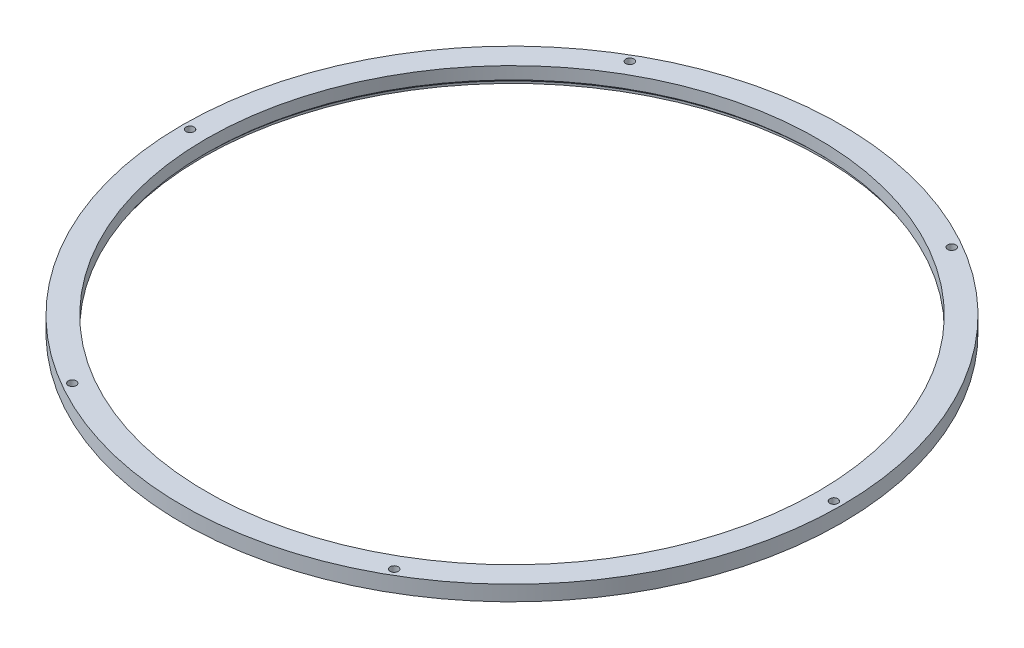
ISO-10303-21;
HEADER;
FILE_DESCRIPTION(('STEP AP214'),'2;1');
FILE_NAME('part.step','',(''),(''),'','','');
FILE_SCHEMA(('AUTOMOTIVE_DESIGN { 1 0 10303 214 1 1 1 1 }'));
ENDSEC;
DATA;
#1=APPLICATION_CONTEXT('core data for automotive mechanical design processes');
#2=APPLICATION_PROTOCOL_DEFINITION('international standard','automotive_design',2000,#1);
#3=PRODUCT_CONTEXT('',#1,'mechanical');
#4=PRODUCT('Part','Part','',(#3));
#5=PRODUCT_RELATED_PRODUCT_CATEGORY('part','',(#4));
#6=PRODUCT_DEFINITION_FORMATION('','',#4);
#7=PRODUCT_DEFINITION_CONTEXT('part definition',#1,'design');
#8=PRODUCT_DEFINITION('design','',#6,#7);
#9=PRODUCT_DEFINITION_SHAPE('','',#8);
#10=(LENGTH_UNIT() NAMED_UNIT(*) SI_UNIT(.MILLI.,.METRE.));
#11=(NAMED_UNIT(*) PLANE_ANGLE_UNIT() SI_UNIT($,.RADIAN.));
#12=(NAMED_UNIT(*) SI_UNIT($,.STERADIAN.) SOLID_ANGLE_UNIT());
#13=UNCERTAINTY_MEASURE_WITH_UNIT(LENGTH_MEASURE(1.E-05),#10,'distance_accuracy_value','');
#14=(GEOMETRIC_REPRESENTATION_CONTEXT(3) GLOBAL_UNCERTAINTY_ASSIGNED_CONTEXT((#13)) GLOBAL_UNIT_ASSIGNED_CONTEXT((#10,
#11,#12)) REPRESENTATION_CONTEXT('',''));
#15=CARTESIAN_POINT('',(0.,0.,0.));
#16=DIRECTION('',(0.,0.,1.));
#17=DIRECTION('',(1.,0.,0.));
#18=AXIS2_PLACEMENT_3D('',#15,#16,#17);
#19=CARTESIAN_POINT('',(168.5,19.,291.8505610754));
#20=DIRECTION('',(0.,-1.,0.));
#21=DIRECTION('',(0.500000000000017,0.,0.866025403784429));
#22=AXIS2_PLACEMENT_3D('',#19,#20,#21);
#23=CYLINDRICAL_SURFACE('',#22,4.25);
#24=CARTESIAN_POINT('',(168.5,19.,291.8505610754));
#25=DIRECTION('',(0.,-1.,0.));
#26=DIRECTION('',(0.500000000000017,0.,0.866025403784429));
#27=AXIS2_PLACEMENT_3D('',#24,#25,#26);
#28=CIRCLE('',#27,4.25);
#29=CARTESIAN_POINT('',(166.375,19.,288.169953109316));
#30=VERTEX_POINT('',#29);
#31=EDGE_CURVE('E196',#30,#30,#28,.T.);
#32=ORIENTED_EDGE('',*,*,#31,.F.);
#33=DIRECTION('',(0.,-1.,0.));
#34=VECTOR('',#33,1.);
#35=CARTESIAN_POINT('',(166.375,19.,288.169953109316));
#36=LINE('',#35,#34);
#37=CARTESIAN_POINT('',(166.375,3.,288.169953109316));
#38=VERTEX_POINT('',#37);
#39=EDGE_CURVE('E11',#30,#38,#36,.T.);
#40=ORIENTED_EDGE('',*,*,#39,.T.);
#41=CARTESIAN_POINT('',(168.5,3.,291.8505610754));
#42=DIRECTION('',(0.,-1.,0.));
#43=DIRECTION('',(0.500000000000017,0.,0.866025403784429));
#44=AXIS2_PLACEMENT_3D('',#41,#42,#43);
#45=CIRCLE('',#44,4.25);
#46=EDGE_CURVE('E213',#38,#38,#45,.T.);
#47=ORIENTED_EDGE('',*,*,#46,.T.);
#48=ORIENTED_EDGE('',*,*,#39,.F.);
#49=EDGE_LOOP('',(#32,#40,#47,#48));
#50=FACE_BOUND('',#49,.T.);
#51=ADVANCED_FACE('F17',(#50),#23,.F.);
#52=CARTESIAN_POINT('',(-168.5,19.,291.8505610754));
#53=DIRECTION('',(0.,-1.,0.));
#54=DIRECTION('',(-0.500000000000017,0.,0.866025403784429));
#55=AXIS2_PLACEMENT_3D('',#52,#53,#54);
#56=CYLINDRICAL_SURFACE('',#55,4.25);
#57=CARTESIAN_POINT('',(-168.5,19.,291.8505610754));
#58=DIRECTION('',(0.,-1.,0.));
#59=DIRECTION('',(-0.500000000000017,0.,0.866025403784429));
#60=AXIS2_PLACEMENT_3D('',#57,#58,#59);
#61=CIRCLE('',#60,4.25);
#62=CARTESIAN_POINT('',(-166.375,19.,288.169953109316));
#63=VERTEX_POINT('',#62);
#64=EDGE_CURVE('E191',#63,#63,#61,.T.);
#65=ORIENTED_EDGE('',*,*,#64,.F.);
#66=DIRECTION('',(0.,-1.,0.));
#67=VECTOR('',#66,1.);
#68=CARTESIAN_POINT('',(-166.375,19.,288.169953109316));
#69=LINE('',#68,#67);
#70=CARTESIAN_POINT('',(-166.375,3.,288.169953109316));
#71=VERTEX_POINT('',#70);
#72=EDGE_CURVE('E28',#63,#71,#69,.T.);
#73=ORIENTED_EDGE('',*,*,#72,.T.);
#74=CARTESIAN_POINT('',(-168.5,3.,291.8505610754));
#75=DIRECTION('',(0.,-1.,0.));
#76=DIRECTION('',(-0.500000000000017,0.,0.866025403784429));
#77=AXIS2_PLACEMENT_3D('',#74,#75,#76);
#78=CIRCLE('',#77,4.25);
#79=EDGE_CURVE('E189',#71,#71,#78,.T.);
#80=ORIENTED_EDGE('',*,*,#79,.T.);
#81=ORIENTED_EDGE('',*,*,#72,.F.);
#82=EDGE_LOOP('',(#65,#73,#80,#81));
#83=FACE_BOUND('',#82,.T.);
#84=ADVANCED_FACE('F19',(#83),#56,.F.);
#85=CARTESIAN_POINT('',(-337.,19.,0.));
#86=DIRECTION('',(0.,-1.,0.));
#87=DIRECTION('',(-1.,0.,0.));
#88=AXIS2_PLACEMENT_3D('',#85,#86,#87);
#89=CYLINDRICAL_SURFACE('',#88,4.25);
#90=CARTESIAN_POINT('',(-337.,19.,0.));
#91=DIRECTION('',(0.,-1.,0.));
#92=DIRECTION('',(-1.,0.,0.));
#93=AXIS2_PLACEMENT_3D('',#90,#91,#92);
#94=CIRCLE('',#93,4.25);
#95=CARTESIAN_POINT('',(-332.75,19.,0.));
#96=VERTEX_POINT('',#95);
#97=EDGE_CURVE('E197',#96,#96,#94,.T.);
#98=ORIENTED_EDGE('',*,*,#97,.F.);
#99=DIRECTION('',(0.,-1.,0.));
#100=VECTOR('',#99,1.);
#101=CARTESIAN_POINT('',(-332.75,19.,0.));
#102=LINE('',#101,#100);
#103=CARTESIAN_POINT('',(-332.75,3.,0.));
#104=VERTEX_POINT('',#103);
#105=EDGE_CURVE('E168',#96,#104,#102,.T.);
#106=ORIENTED_EDGE('',*,*,#105,.T.);
#107=CARTESIAN_POINT('',(-337.,3.,0.));
#108=DIRECTION('',(0.,-1.,0.));
#109=DIRECTION('',(-1.,0.,0.));
#110=AXIS2_PLACEMENT_3D('',#107,#108,#109);
#111=CIRCLE('',#110,4.25);
#112=EDGE_CURVE('E21',#104,#104,#111,.T.);
#113=ORIENTED_EDGE('',*,*,#112,.T.);
#114=ORIENTED_EDGE('',*,*,#105,.F.);
#115=EDGE_LOOP('',(#98,#106,#113,#114));
#116=FACE_BOUND('',#115,.T.);
#117=ADVANCED_FACE('F293',(#116),#89,.F.);
#118=CARTESIAN_POINT('',(-168.5,19.,-291.8505610754));
#119=DIRECTION('',(0.,-1.,0.));
#120=DIRECTION('',(-0.500000000000017,0.,-0.866025403784429));
#121=AXIS2_PLACEMENT_3D('',#118,#119,#120);
#122=CYLINDRICAL_SURFACE('',#121,4.25);
#123=CARTESIAN_POINT('',(-168.5,19.,-291.8505610754));
#124=DIRECTION('',(0.,-1.,0.));
#125=DIRECTION('',(-0.500000000000017,0.,-0.866025403784429));
#126=AXIS2_PLACEMENT_3D('',#123,#124,#125);
#127=CIRCLE('',#126,4.25);
#128=CARTESIAN_POINT('',(-166.375,19.,-288.169953109316));
#129=VERTEX_POINT('',#128);
#130=EDGE_CURVE('E144',#129,#129,#127,.T.);
#131=ORIENTED_EDGE('',*,*,#130,.F.);
#132=DIRECTION('',(0.,-1.,0.));
#133=VECTOR('',#132,1.);
#134=CARTESIAN_POINT('',(-166.375,19.,-288.169953109316));
#135=LINE('',#134,#133);
#136=CARTESIAN_POINT('',(-166.375,3.,-288.169953109316));
#137=VERTEX_POINT('',#136);
#138=EDGE_CURVE('E172',#129,#137,#135,.T.);
#139=ORIENTED_EDGE('',*,*,#138,.T.);
#140=CARTESIAN_POINT('',(-168.5,3.,-291.8505610754));
#141=DIRECTION('',(0.,-1.,0.));
#142=DIRECTION('',(-0.500000000000017,0.,-0.866025403784429));
#143=AXIS2_PLACEMENT_3D('',#140,#141,#142);
#144=CIRCLE('',#143,4.25);
#145=EDGE_CURVE('E221',#137,#137,#144,.T.);
#146=ORIENTED_EDGE('',*,*,#145,.T.);
#147=ORIENTED_EDGE('',*,*,#138,.F.);
#148=EDGE_LOOP('',(#131,#139,#146,#147));
#149=FACE_BOUND('',#148,.T.);
#150=ADVANCED_FACE('F304',(#149),#122,.F.);
#151=CARTESIAN_POINT('',(168.5,19.,-291.8505610754));
#152=DIRECTION('',(0.,-1.,0.));
#153=DIRECTION('',(0.500000000000017,0.,-0.866025403784429));
#154=AXIS2_PLACEMENT_3D('',#151,#152,#153);
#155=CYLINDRICAL_SURFACE('',#154,4.25);
#156=CARTESIAN_POINT('',(168.5,19.,-291.8505610754));
#157=DIRECTION('',(0.,-1.,0.));
#158=DIRECTION('',(0.500000000000017,0.,-0.866025403784429));
#159=AXIS2_PLACEMENT_3D('',#156,#157,#158);
#160=CIRCLE('',#159,4.25);
#161=CARTESIAN_POINT('',(166.375,19.,-288.169953109316));
#162=VERTEX_POINT('',#161);
#163=EDGE_CURVE('E135',#162,#162,#160,.T.);
#164=ORIENTED_EDGE('',*,*,#163,.F.);
#165=DIRECTION('',(0.,-1.,0.));
#166=VECTOR('',#165,1.);
#167=CARTESIAN_POINT('',(166.375,19.,-288.169953109316));
#168=LINE('',#167,#166);
#169=CARTESIAN_POINT('',(166.375,3.,-288.169953109316));
#170=VERTEX_POINT('',#169);
#171=EDGE_CURVE('E176',#162,#170,#168,.T.);
#172=ORIENTED_EDGE('',*,*,#171,.T.);
#173=CARTESIAN_POINT('',(168.5,3.,-291.8505610754));
#174=DIRECTION('',(0.,-1.,0.));
#175=DIRECTION('',(0.500000000000017,0.,-0.866025403784429));
#176=AXIS2_PLACEMENT_3D('',#173,#174,#175);
#177=CIRCLE('',#176,4.25);
#178=EDGE_CURVE('E218',#170,#170,#177,.T.);
#179=ORIENTED_EDGE('',*,*,#178,.T.);
#180=ORIENTED_EDGE('',*,*,#171,.F.);
#181=EDGE_LOOP('',(#164,#172,#179,#180));
#182=FACE_BOUND('',#181,.T.);
#183=ADVANCED_FACE('F272',(#182),#155,.F.);
#184=CARTESIAN_POINT('',(337.,19.,0.));
#185=DIRECTION('',(0.,-1.,0.));
#186=DIRECTION('',(1.,0.,0.));
#187=AXIS2_PLACEMENT_3D('',#184,#185,#186);
#188=CYLINDRICAL_SURFACE('',#187,4.25);
#189=CARTESIAN_POINT('',(337.,19.,0.));
#190=DIRECTION('',(0.,-1.,0.));
#191=DIRECTION('',(1.,0.,0.));
#192=AXIS2_PLACEMENT_3D('',#189,#190,#191);
#193=CIRCLE('',#192,4.25);
#194=CARTESIAN_POINT('',(332.75,19.,0.));
#195=VERTEX_POINT('',#194);
#196=EDGE_CURVE('E132',#195,#195,#193,.T.);
#197=ORIENTED_EDGE('',*,*,#196,.F.);
#198=DIRECTION('',(0.,-1.,0.));
#199=VECTOR('',#198,1.);
#200=CARTESIAN_POINT('',(332.75,19.,0.));
#201=LINE('',#200,#199);
#202=CARTESIAN_POINT('',(332.75,3.,0.));
#203=VERTEX_POINT('',#202);
#204=EDGE_CURVE('E179',#195,#203,#201,.T.);
#205=ORIENTED_EDGE('',*,*,#204,.T.);
#206=CARTESIAN_POINT('',(337.,3.,0.));
#207=DIRECTION('',(0.,-1.,0.));
#208=DIRECTION('',(1.,0.,0.));
#209=AXIS2_PLACEMENT_3D('',#206,#207,#208);
#210=CIRCLE('',#209,4.25);
#211=EDGE_CURVE('E158',#203,#203,#210,.T.);
#212=ORIENTED_EDGE('',*,*,#211,.T.);
#213=ORIENTED_EDGE('',*,*,#204,.F.);
#214=EDGE_LOOP('',(#197,#205,#212,#213));
#215=FACE_BOUND('',#214,.T.);
#216=ADVANCED_FACE('F286',(#215),#188,.F.);
#217=CARTESIAN_POINT('',(0.,-0.95,0.));
#218=DIRECTION('',(0.,1.,0.));
#219=DIRECTION('',(1.,0.,0.));
#220=AXIS2_PLACEMENT_3D('',#217,#218,#219);
#221=CYLINDRICAL_SURFACE('',#220,345.);
#222=CARTESIAN_POINT('',(0.,19.,0.));
#223=DIRECTION('',(0.,1.,0.));
#224=DIRECTION('',(1.,0.,0.));
#225=AXIS2_PLACEMENT_3D('',#222,#223,#224);
#226=CIRCLE('',#225,345.);
#227=CARTESIAN_POINT('',(-345.,19.,0.));
#228=VERTEX_POINT('',#227);
#229=EDGE_CURVE('E136',#228,#228,#226,.T.);
#230=ORIENTED_EDGE('',*,*,#229,.F.);
#231=DIRECTION('',(0.,-1.,0.));
#232=VECTOR('',#231,1.);
#233=CARTESIAN_POINT('',(-345.,-0.95,0.));
#234=LINE('',#233,#232);
#235=CARTESIAN_POINT('',(-345.,3.,0.));
#236=VERTEX_POINT('',#235);
#237=EDGE_CURVE('E130',#228,#236,#234,.T.);
#238=ORIENTED_EDGE('',*,*,#237,.T.);
#239=CARTESIAN_POINT('',(0.,3.,0.));
#240=DIRECTION('',(0.,-1.,0.));
#241=DIRECTION('',(1.,0.,0.));
#242=AXIS2_PLACEMENT_3D('',#239,#240,#241);
#243=CIRCLE('',#242,345.);
#244=EDGE_CURVE('E159',#236,#236,#243,.T.);
#245=ORIENTED_EDGE('',*,*,#244,.F.);
#246=ORIENTED_EDGE('',*,*,#237,.F.);
#247=EDGE_LOOP('',(#230,#238,#245,#246));
#248=FACE_BOUND('',#247,.T.);
#249=ADVANCED_FACE('F276',(#248),#221,.T.);
#250=CARTESIAN_POINT('',(0.,19.,0.));
#251=DIRECTION('',(0.,1.,0.));
#252=DIRECTION('',(1.,0.,0.));
#253=AXIS2_PLACEMENT_3D('',#250,#251,#252);
#254=PLANE('',#253);
#255=ORIENTED_EDGE('',*,*,#31,.T.);
#256=EDGE_LOOP('',(#255));
#257=FACE_BOUND('',#256,.T.);
#258=ORIENTED_EDGE('',*,*,#64,.T.);
#259=EDGE_LOOP('',(#258));
#260=FACE_BOUND('',#259,.T.);
#261=ORIENTED_EDGE('',*,*,#97,.T.);
#262=EDGE_LOOP('',(#261));
#263=FACE_BOUND('',#262,.T.);
#264=ORIENTED_EDGE('',*,*,#130,.T.);
#265=EDGE_LOOP('',(#264));
#266=FACE_BOUND('',#265,.T.);
#267=ORIENTED_EDGE('',*,*,#163,.T.);
#268=EDGE_LOOP('',(#267));
#269=FACE_BOUND('',#268,.T.);
#270=ORIENTED_EDGE('',*,*,#196,.T.);
#271=EDGE_LOOP('',(#270));
#272=FACE_BOUND('',#271,.T.);
#273=CARTESIAN_POINT('',(0.,19.,0.));
#274=DIRECTION('',(0.,1.,0.));
#275=DIRECTION('',(1.,0.,0.));
#276=AXIS2_PLACEMENT_3D('',#273,#274,#275);
#277=CIRCLE('',#276,320.);
#278=CARTESIAN_POINT('',(-320.,19.,0.));
#279=VERTEX_POINT('',#278);
#280=EDGE_CURVE('E147',#279,#279,#277,.T.);
#281=ORIENTED_EDGE('',*,*,#280,.F.);
#282=EDGE_LOOP('',(#281));
#283=FACE_BOUND('',#282,.T.);
#284=ORIENTED_EDGE('',*,*,#229,.T.);
#285=EDGE_LOOP('',(#284));
#286=FACE_BOUND('',#285,.T.);
#287=ADVANCED_FACE('F193',(#257,#260,#263,#266,#269,#272,#283,#286),#254,.T.);
#288=CARTESIAN_POINT('',(0.,-0.95,0.));
#289=DIRECTION('',(0.,1.,0.));
#290=DIRECTION('',(1.,0.,0.));
#291=AXIS2_PLACEMENT_3D('',#288,#289,#290);
#292=CYLINDRICAL_SURFACE('',#291,320.);
#293=CARTESIAN_POINT('',(0.,6.,0.));
#294=DIRECTION('',(0.,1.,0.));
#295=DIRECTION('',(-1.,0.,0.));
#296=AXIS2_PLACEMENT_3D('',#293,#294,#295);
#297=CIRCLE('',#296,320.);
#298=CARTESIAN_POINT('',(0.,5.99999999999906,320.));
#299=VERTEX_POINT('',#298);
#300=CARTESIAN_POINT('',(-320.,6.,0.));
#301=VERTEX_POINT('',#300);
#302=EDGE_CURVE('E217',#299,#301,#297,.T.);
#303=ORIENTED_EDGE('',*,*,#302,.F.);
#304=CARTESIAN_POINT('',(0.,6.,0.));
#305=DIRECTION('',(0.,1.,0.));
#306=DIRECTION('',(-1.,0.,0.));
#307=AXIS2_PLACEMENT_3D('',#304,#305,#306);
#308=CIRCLE('',#307,320.);
#309=EDGE_CURVE('E167',#301,#299,#308,.T.);
#310=ORIENTED_EDGE('',*,*,#309,.F.);
#311=DIRECTION('',(0.,1.,0.));
#312=VECTOR('',#311,1.);
#313=CARTESIAN_POINT('',(-320.,-0.95,0.));
#314=LINE('',#313,#312);
#315=EDGE_CURVE('E154',#301,#279,#314,.T.);
#316=ORIENTED_EDGE('',*,*,#315,.T.);
#317=ORIENTED_EDGE('',*,*,#280,.T.);
#318=ORIENTED_EDGE('',*,*,#315,.F.);
#319=EDGE_LOOP('',(#303,#310,#316,#317,#318));
#320=FACE_BOUND('',#319,.T.);
#321=ADVANCED_FACE('F255',(#320),#292,.F.);
#322=CARTESIAN_POINT('',(0.,4.500000001398,0.));
#323=DIRECTION('',(0.,-1.,0.));
#324=DIRECTION('',(0.,0.,-1.));
#325=AXIS2_PLACEMENT_3D('',#322,#323,#324);
#326=CONICAL_SURFACE('',#325,321.4999999986,0.785398163397448);
#327=ORIENTED_EDGE('',*,*,#302,.T.);
#328=ORIENTED_EDGE('',*,*,#309,.T.);
#329=DIRECTION('',(0.,-0.707106781186548,0.707106781186548));
#330=VECTOR('',#329,1.);
#331=CARTESIAN_POINT('',(0.,4.500000001398,321.4999999986));
#332=LINE('',#331,#330);
#333=CARTESIAN_POINT('',(0.,2.99999999999895,323.));
#334=VERTEX_POINT('',#333);
#335=EDGE_CURVE('E164',#299,#334,#332,.T.);
#336=ORIENTED_EDGE('',*,*,#335,.T.);
#337=CARTESIAN_POINT('',(0.,3.,0.));
#338=DIRECTION('',(0.,1.,0.));
#339=DIRECTION('',(-1.,0.,0.));
#340=AXIS2_PLACEMENT_3D('',#337,#338,#339);
#341=CIRCLE('',#340,323.);
#342=EDGE_CURVE('E181',#334,#334,#341,.T.);
#343=ORIENTED_EDGE('',*,*,#342,.F.);
#344=ORIENTED_EDGE('',*,*,#335,.F.);
#345=EDGE_LOOP('',(#327,#328,#336,#343,#344));
#346=FACE_BOUND('',#345,.T.);
#347=ADVANCED_FACE('F251',(#346),#326,.F.);
#348=CARTESIAN_POINT('',(0.,3.,0.));
#349=DIRECTION('',(0.,1.,0.));
#350=DIRECTION('',(1.,0.,0.));
#351=AXIS2_PLACEMENT_3D('',#348,#349,#350);
#352=PLANE('',#351);
#353=ORIENTED_EDGE('',*,*,#342,.T.);
#354=EDGE_LOOP('',(#353));
#355=FACE_BOUND('',#354,.T.);
#356=CARTESIAN_POINT('',(0.,3.,0.));
#357=DIRECTION('',(0.,1.,0.));
#358=DIRECTION('',(1.,0.,0.));
#359=AXIS2_PLACEMENT_3D('',#356,#357,#358);
#360=CIRCLE('',#359,324.);
#361=CARTESIAN_POINT('',(-324.,3.,0.));
#362=VERTEX_POINT('',#361);
#363=EDGE_CURVE('E104',#362,#362,#360,.T.);
#364=ORIENTED_EDGE('',*,*,#363,.F.);
#365=EDGE_LOOP('',(#364));
#366=FACE_BOUND('',#365,.T.);
#367=ADVANCED_FACE('F249',(#355,#366),#352,.F.);
#368=CARTESIAN_POINT('',(0.,-0.95,0.));
#369=DIRECTION('',(0.,1.,0.));
#370=DIRECTION('',(1.,0.,0.));
#371=AXIS2_PLACEMENT_3D('',#368,#369,#370);
#372=CYLINDRICAL_SURFACE('',#371,324.);
#373=CARTESIAN_POINT('',(0.,0.,0.));
#374=DIRECTION('',(0.,1.,0.));
#375=DIRECTION('',(1.,0.,0.));
#376=AXIS2_PLACEMENT_3D('',#373,#374,#375);
#377=CIRCLE('',#376,324.);
#378=CARTESIAN_POINT('',(-324.,0.,0.));
#379=VERTEX_POINT('',#378);
#380=EDGE_CURVE('E114',#379,#379,#377,.T.);
#381=ORIENTED_EDGE('',*,*,#380,.F.);
#382=DIRECTION('',(0.,1.,0.));
#383=VECTOR('',#382,1.);
#384=CARTESIAN_POINT('',(-324.,-0.95,0.));
#385=LINE('',#384,#383);
#386=EDGE_CURVE('E111',#379,#362,#385,.T.);
#387=ORIENTED_EDGE('',*,*,#386,.T.);
#388=ORIENTED_EDGE('',*,*,#363,.T.);
#389=ORIENTED_EDGE('',*,*,#386,.F.);
#390=EDGE_LOOP('',(#381,#387,#388,#389));
#391=FACE_BOUND('',#390,.T.);
#392=ADVANCED_FACE('F113',(#391),#372,.F.);
#393=CARTESIAN_POINT('',(0.,0.,0.));
#394=DIRECTION('',(0.,1.,0.));
#395=DIRECTION('',(1.,0.,0.));
#396=AXIS2_PLACEMENT_3D('',#393,#394,#395);
#397=PLANE('',#396);
#398=ORIENTED_EDGE('',*,*,#380,.T.);
#399=EDGE_LOOP('',(#398));
#400=FACE_BOUND('',#399,.T.);
#401=CARTESIAN_POINT('',(0.,0.,0.));
#402=DIRECTION('',(0.,1.,0.));
#403=DIRECTION('',(1.,0.,0.));
#404=AXIS2_PLACEMENT_3D('',#401,#402,#403);
#405=CIRCLE('',#404,327.);
#406=CARTESIAN_POINT('',(-327.,0.,0.));
#407=VERTEX_POINT('',#406);
#408=EDGE_CURVE('E121',#407,#407,#405,.T.);
#409=ORIENTED_EDGE('',*,*,#408,.F.);
#410=EDGE_LOOP('',(#409));
#411=FACE_BOUND('',#410,.T.);
#412=ADVANCED_FACE('F118',(#400,#411),#397,.F.);
#413=CARTESIAN_POINT('',(0.,-0.95,0.));
#414=DIRECTION('',(0.,1.,0.));
#415=DIRECTION('',(1.,0.,0.));
#416=AXIS2_PLACEMENT_3D('',#413,#414,#415);
#417=CYLINDRICAL_SURFACE('',#416,327.);
#418=CARTESIAN_POINT('',(0.,3.,0.));
#419=DIRECTION('',(0.,1.,0.));
#420=DIRECTION('',(1.,0.,0.));
#421=AXIS2_PLACEMENT_3D('',#418,#419,#420);
#422=CIRCLE('',#421,327.);
#423=CARTESIAN_POINT('',(-327.,3.,0.));
#424=VERTEX_POINT('',#423);
#425=EDGE_CURVE('E162',#424,#424,#422,.T.);
#426=ORIENTED_EDGE('',*,*,#425,.F.);
#427=DIRECTION('',(0.,-1.,0.));
#428=VECTOR('',#427,1.);
#429=CARTESIAN_POINT('',(-327.,-0.95,0.));
#430=LINE('',#429,#428);
#431=EDGE_CURVE('E127',#424,#407,#430,.T.);
#432=ORIENTED_EDGE('',*,*,#431,.T.);
#433=ORIENTED_EDGE('',*,*,#408,.T.);
#434=ORIENTED_EDGE('',*,*,#431,.F.);
#435=EDGE_LOOP('',(#426,#432,#433,#434));
#436=FACE_BOUND('',#435,.T.);
#437=ADVANCED_FACE('F297',(#436),#417,.T.);
#438=CARTESIAN_POINT('',(0.,3.,0.));
#439=DIRECTION('',(0.,1.,0.));
#440=DIRECTION('',(1.,0.,0.));
#441=AXIS2_PLACEMENT_3D('',#438,#439,#440);
#442=PLANE('',#441);
#443=ORIENTED_EDGE('',*,*,#46,.F.);
#444=EDGE_LOOP('',(#443));
#445=FACE_BOUND('',#444,.T.);
#446=ORIENTED_EDGE('',*,*,#79,.F.);
#447=EDGE_LOOP('',(#446));
#448=FACE_BOUND('',#447,.T.);
#449=ORIENTED_EDGE('',*,*,#112,.F.);
#450=EDGE_LOOP('',(#449));
#451=FACE_BOUND('',#450,.T.);
#452=ORIENTED_EDGE('',*,*,#145,.F.);
#453=EDGE_LOOP('',(#452));
#454=FACE_BOUND('',#453,.T.);
#455=ORIENTED_EDGE('',*,*,#178,.F.);
#456=EDGE_LOOP('',(#455));
#457=FACE_BOUND('',#456,.T.);
#458=ORIENTED_EDGE('',*,*,#211,.F.);
#459=EDGE_LOOP('',(#458));
#460=FACE_BOUND('',#459,.T.);
#461=ORIENTED_EDGE('',*,*,#425,.T.);
#462=EDGE_LOOP('',(#461));
#463=FACE_BOUND('',#462,.T.);
#464=ORIENTED_EDGE('',*,*,#244,.T.);
#465=EDGE_LOOP('',(#464));
#466=FACE_BOUND('',#465,.T.);
#467=ADVANCED_FACE('F309',(#445,#448,#451,#454,#457,#460,#463,#466),#442,.F.);
#468=CLOSED_SHELL('',(#51,#84,#117,#150,#183,#216,#249,#287,#321,#347,#367,#392,#412,#437,#467));
#469=MANIFOLD_SOLID_BREP('B1',#468);
#470=ADVANCED_BREP_SHAPE_REPRESENTATION('',(#18,#469),#14);
#471=SHAPE_DEFINITION_REPRESENTATION(#9,#470);
ENDSEC;
END-ISO-10303-21;
